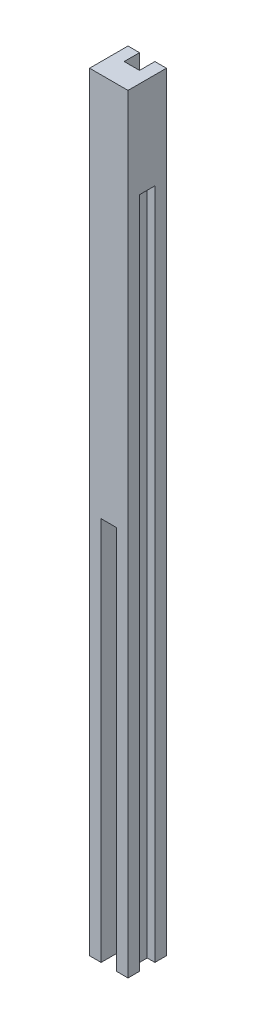
ISO-10303-21;
HEADER;
FILE_DESCRIPTION(('STEP AP214'),'2;1');
FILE_NAME('part.step','',(''),(''),'','','');
FILE_SCHEMA(('AUTOMOTIVE_DESIGN { 1 0 10303 214 1 1 1 1 }'));
ENDSEC;
DATA;
#1=APPLICATION_CONTEXT('core data for automotive mechanical design processes');
#2=APPLICATION_PROTOCOL_DEFINITION('international standard','automotive_design',2000,#1);
#3=PRODUCT_CONTEXT('',#1,'mechanical');
#4=PRODUCT('Part','Part','',(#3));
#5=PRODUCT_RELATED_PRODUCT_CATEGORY('part','',(#4));
#6=PRODUCT_DEFINITION_FORMATION('','',#4);
#7=PRODUCT_DEFINITION_CONTEXT('part definition',#1,'design');
#8=PRODUCT_DEFINITION('design','',#6,#7);
#9=PRODUCT_DEFINITION_SHAPE('','',#8);
#10=(LENGTH_UNIT() NAMED_UNIT(*) SI_UNIT(.MILLI.,.METRE.));
#11=(NAMED_UNIT(*) PLANE_ANGLE_UNIT() SI_UNIT($,.RADIAN.));
#12=(NAMED_UNIT(*) SI_UNIT($,.STERADIAN.) SOLID_ANGLE_UNIT());
#13=UNCERTAINTY_MEASURE_WITH_UNIT(LENGTH_MEASURE(1.E-05),#10,'distance_accuracy_value','');
#14=(GEOMETRIC_REPRESENTATION_CONTEXT(3) GLOBAL_UNCERTAINTY_ASSIGNED_CONTEXT((#13)) GLOBAL_UNIT_ASSIGNED_CONTEXT((#10,
#11,#12)) REPRESENTATION_CONTEXT('',''));
#15=CARTESIAN_POINT('',(0.,0.,0.));
#16=DIRECTION('',(0.,0.,1.));
#17=DIRECTION('',(1.,0.,0.));
#18=AXIS2_PLACEMENT_3D('',#15,#16,#17);
#19=CARTESIAN_POINT('',(-33.4918902303552,200.,-32.6944400252682));
#20=DIRECTION('',(-1.,0.,0.));
#21=DIRECTION('',(0.,0.,1.));
#22=AXIS2_PLACEMENT_3D('',#19,#20,#21);
#23=PLANE('',#22);
#24=DIRECTION('',(0.,-1.,0.));
#25=VECTOR('',#24,1.);
#26=CARTESIAN_POINT('',(-33.4918902303552,175.,-29.6944400252681));
#27=LINE('',#26,#25);
#28=CARTESIAN_POINT('',(-33.4918902303552,175.,-29.6944400252681));
#29=VERTEX_POINT('',#28);
#30=CARTESIAN_POINT('',(-33.4918902303552,0.,-29.6944400252681));
#31=VERTEX_POINT('',#30);
#32=EDGE_CURVE('E193',#29,#31,#27,.T.);
#33=ORIENTED_EDGE('',*,*,#32,.T.);
#34=DIRECTION('',(0.,0.,-1.));
#35=VECTOR('',#34,1.);
#36=CARTESIAN_POINT('',(-33.4918902303552,0.,-32.6944400252682));
#37=LINE('',#36,#35);
#38=CARTESIAN_POINT('',(-33.4918902303552,0.,-32.6944400252682));
#39=VERTEX_POINT('',#38);
#40=EDGE_CURVE('E302',#31,#39,#37,.T.);
#41=ORIENTED_EDGE('',*,*,#40,.T.);
#42=DIRECTION('',(0.,-1.,0.));
#43=VECTOR('',#42,1.);
#44=CARTESIAN_POINT('',(-33.4918902303552,200.,-32.6944400252682));
#45=LINE('',#44,#43);
#46=CARTESIAN_POINT('',(-33.4918902303552,200.,-32.6944400252682));
#47=VERTEX_POINT('',#46);
#48=EDGE_CURVE('E309',#47,#39,#45,.T.);
#49=ORIENTED_EDGE('',*,*,#48,.F.);
#50=DIRECTION('',(0.,0.,-1.));
#51=VECTOR('',#50,1.);
#52=CARTESIAN_POINT('',(-33.4918902303552,200.,-32.6944400252682));
#53=LINE('',#52,#51);
#54=CARTESIAN_POINT('',(-33.4918902303552,200.,-22.6944400252682));
#55=VERTEX_POINT('',#54);
#56=EDGE_CURVE('E288',#55,#47,#53,.T.);
#57=ORIENTED_EDGE('',*,*,#56,.F.);
#58=DIRECTION('',(0.,-1.,0.));
#59=VECTOR('',#58,1.);
#60=CARTESIAN_POINT('',(-33.4918902303552,200.,-22.6944400252682));
#61=LINE('',#60,#59);
#62=CARTESIAN_POINT('',(-33.4918902303552,0.,-22.6944400252682));
#63=VERTEX_POINT('',#62);
#64=EDGE_CURVE('E42',#55,#63,#61,.T.);
#65=ORIENTED_EDGE('',*,*,#64,.T.);
#66=CARTESIAN_POINT('',(-33.4918902303552,0.,-25.6944400252682));
#67=VERTEX_POINT('',#66);
#68=EDGE_CURVE('E303',#63,#67,#37,.T.);
#69=ORIENTED_EDGE('',*,*,#68,.T.);
#70=DIRECTION('',(0.,-1.,0.));
#71=VECTOR('',#70,1.);
#72=CARTESIAN_POINT('',(-33.4918902303552,175.,-25.6944400252681));
#73=LINE('',#72,#71);
#74=CARTESIAN_POINT('',(-33.4918902303552,175.,-25.6944400252681));
#75=VERTEX_POINT('',#74);
#76=EDGE_CURVE('E189',#75,#67,#73,.T.);
#77=ORIENTED_EDGE('',*,*,#76,.F.);
#78=DIRECTION('',(0.,0.,-1.));
#79=VECTOR('',#78,1.);
#80=CARTESIAN_POINT('',(-33.4918902303552,175.,-25.6944400252681));
#81=LINE('',#80,#79);
#82=EDGE_CURVE('E329',#75,#29,#81,.T.);
#83=ORIENTED_EDGE('',*,*,#82,.T.);
#84=EDGE_LOOP('',(#33,#41,#49,#57,#65,#69,#77,#83));
#85=FACE_BOUND('',#84,.T.);
#86=ADVANCED_FACE('F34',(#85),#23,.F.);
#87=CARTESIAN_POINT('',(0.,0.,0.));
#88=DIRECTION('',(0.,1.,0.));
#89=DIRECTION('',(0.,0.,1.));
#90=AXIS2_PLACEMENT_3D('',#87,#88,#89);
#91=PLANE('',#90);
#92=DIRECTION('',(1.,0.,0.));
#93=VECTOR('',#92,1.);
#94=CARTESIAN_POINT('',(-35.4918902303552,0.,-29.6944400252681));
#95=LINE('',#94,#93);
#96=CARTESIAN_POINT('',(-35.4918902303552,0.,-29.6944400252681));
#97=VERTEX_POINT('',#96);
#98=EDGE_CURVE('E195',#97,#31,#95,.T.);
#99=ORIENTED_EDGE('',*,*,#98,.F.);
#100=DIRECTION('',(0.,0.,-1.));
#101=VECTOR('',#100,1.);
#102=CARTESIAN_POINT('',(-35.4918902303552,0.,-25.6944400252682));
#103=LINE('',#102,#101);
#104=CARTESIAN_POINT('',(-35.4918902303552,0.,-25.6944400252681));
#105=VERTEX_POINT('',#104);
#106=EDGE_CURVE('E177',#105,#97,#103,.T.);
#107=ORIENTED_EDGE('',*,*,#106,.F.);
#108=DIRECTION('',(1.,0.,0.));
#109=VECTOR('',#108,1.);
#110=CARTESIAN_POINT('',(-35.4918902303552,0.,-25.6944400252682));
#111=LINE('',#110,#109);
#112=EDGE_CURVE('E199',#105,#67,#111,.T.);
#113=ORIENTED_EDGE('',*,*,#112,.T.);
#114=ORIENTED_EDGE('',*,*,#68,.F.);
#115=DIRECTION('',(1.,0.,0.));
#116=VECTOR('',#115,1.);
#117=CARTESIAN_POINT('',(-43.4918902303552,0.,-22.6944400252682));
#118=LINE('',#117,#116);
#119=CARTESIAN_POINT('',(-36.4918902303553,0.,-22.6944400252682));
#120=VERTEX_POINT('',#119);
#121=EDGE_CURVE('E298',#120,#63,#118,.T.);
#122=ORIENTED_EDGE('',*,*,#121,.F.);
#123=DIRECTION('',(0.,0.,1.));
#124=VECTOR('',#123,1.);
#125=CARTESIAN_POINT('',(-36.4918902303553,0.,-26.6944400252682));
#126=LINE('',#125,#124);
#127=CARTESIAN_POINT('',(-36.4918902303553,0.,-26.6944400252682));
#128=VERTEX_POINT('',#127);
#129=EDGE_CURVE('E221',#128,#120,#126,.T.);
#130=ORIENTED_EDGE('',*,*,#129,.F.);
#131=DIRECTION('',(1.,0.,0.));
#132=VECTOR('',#131,1.);
#133=CARTESIAN_POINT('',(-40.4918902303553,0.,-26.6944400252682));
#134=LINE('',#133,#132);
#135=CARTESIAN_POINT('',(-40.4918902303553,0.,-26.6944400252682));
#136=VERTEX_POINT('',#135);
#137=EDGE_CURVE('E204',#136,#128,#134,.T.);
#138=ORIENTED_EDGE('',*,*,#137,.F.);
#139=DIRECTION('',(0.,0.,1.));
#140=VECTOR('',#139,1.);
#141=CARTESIAN_POINT('',(-40.4918902303553,0.,-26.6944400252682));
#142=LINE('',#141,#140);
#143=CARTESIAN_POINT('',(-40.4918902303553,0.,-22.6944400252682));
#144=VERTEX_POINT('',#143);
#145=EDGE_CURVE('E210',#136,#144,#142,.T.);
#146=ORIENTED_EDGE('',*,*,#145,.T.);
#147=CARTESIAN_POINT('',(-43.4918902303552,0.,-22.6944400252682));
#148=VERTEX_POINT('',#147);
#149=EDGE_CURVE('E299',#148,#144,#118,.T.);
#150=ORIENTED_EDGE('',*,*,#149,.F.);
#151=DIRECTION('',(0.,0.,1.));
#152=VECTOR('',#151,1.);
#153=CARTESIAN_POINT('',(-43.4918902303552,0.,-32.6944400252682));
#154=LINE('',#153,#152);
#155=CARTESIAN_POINT('',(-43.4918902303552,0.,-25.6944400252682));
#156=VERTEX_POINT('',#155);
#157=EDGE_CURVE('E275',#156,#148,#154,.T.);
#158=ORIENTED_EDGE('',*,*,#157,.F.);
#159=DIRECTION('',(-1.,0.,0.));
#160=VECTOR('',#159,1.);
#161=CARTESIAN_POINT('',(-41.4918902303552,0.,-25.6944400252682));
#162=LINE('',#161,#160);
#163=CARTESIAN_POINT('',(-41.4918902303552,0.,-25.6944400252682));
#164=VERTEX_POINT('',#163);
#165=EDGE_CURVE('E249',#164,#156,#162,.T.);
#166=ORIENTED_EDGE('',*,*,#165,.F.);
#167=DIRECTION('',(0.,0.,1.));
#168=VECTOR('',#167,1.);
#169=CARTESIAN_POINT('',(-41.4918902303552,0.,-29.6944400252682));
#170=LINE('',#169,#168);
#171=CARTESIAN_POINT('',(-41.4918902303552,0.,-29.6944400252682));
#172=VERTEX_POINT('',#171);
#173=EDGE_CURVE('E227',#172,#164,#170,.T.);
#174=ORIENTED_EDGE('',*,*,#173,.F.);
#175=DIRECTION('',(-1.,0.,0.));
#176=VECTOR('',#175,1.);
#177=CARTESIAN_POINT('',(-41.4918902303552,0.,-29.6944400252682));
#178=LINE('',#177,#176);
#179=CARTESIAN_POINT('',(-43.4918902303552,0.,-29.6944400252682));
#180=VERTEX_POINT('',#179);
#181=EDGE_CURVE('E237',#172,#180,#178,.T.);
#182=ORIENTED_EDGE('',*,*,#181,.T.);
#183=CARTESIAN_POINT('',(-43.4918902303552,0.,-32.6944400252682));
#184=VERTEX_POINT('',#183);
#185=EDGE_CURVE('E295',#184,#180,#154,.T.);
#186=ORIENTED_EDGE('',*,*,#185,.F.);
#187=DIRECTION('',(-1.,0.,0.));
#188=VECTOR('',#187,1.);
#189=CARTESIAN_POINT('',(-43.4918902303552,0.,-32.6944400252682));
#190=LINE('',#189,#188);
#191=EDGE_CURVE('E286',#39,#184,#190,.T.);
#192=ORIENTED_EDGE('',*,*,#191,.F.);
#193=ORIENTED_EDGE('',*,*,#40,.F.);
#194=EDGE_LOOP('',(#99,#107,#113,#114,#122,#130,#138,#146,#150,#158,#166,#174,#182,#186,#192,#193));
#195=FACE_BOUND('',#194,.T.);
#196=ADVANCED_FACE('F322',(#195),#91,.F.);
#197=CARTESIAN_POINT('',(-43.4918902303552,200.,-32.6944400252682));
#198=DIRECTION('',(1.,0.,0.));
#199=DIRECTION('',(0.,0.,-1.));
#200=AXIS2_PLACEMENT_3D('',#197,#198,#199);
#201=PLANE('',#200);
#202=ORIENTED_EDGE('',*,*,#185,.T.);
#203=DIRECTION('',(0.,-1.,0.));
#204=VECTOR('',#203,1.);
#205=CARTESIAN_POINT('',(-43.4918902303552,175.,-29.6944400252682));
#206=LINE('',#205,#204);
#207=CARTESIAN_POINT('',(-43.4918902303552,175.,-29.6944400252682));
#208=VERTEX_POINT('',#207);
#209=EDGE_CURVE('E218',#208,#180,#206,.T.);
#210=ORIENTED_EDGE('',*,*,#209,.F.);
#211=DIRECTION('',(0.,0.,-1.));
#212=VECTOR('',#211,1.);
#213=CARTESIAN_POINT('',(-43.4918902303552,175.,-29.6944400252682));
#214=LINE('',#213,#212);
#215=CARTESIAN_POINT('',(-43.4918902303552,175.,-25.6944400252682));
#216=VERTEX_POINT('',#215);
#217=EDGE_CURVE('E228',#216,#208,#214,.T.);
#218=ORIENTED_EDGE('',*,*,#217,.F.);
#219=DIRECTION('',(0.,1.,0.));
#220=VECTOR('',#219,1.);
#221=CARTESIAN_POINT('',(-43.4918902303552,175.,-25.6944400252682));
#222=LINE('',#221,#220);
#223=EDGE_CURVE('E239',#156,#216,#222,.T.);
#224=ORIENTED_EDGE('',*,*,#223,.F.);
#225=ORIENTED_EDGE('',*,*,#157,.T.);
#226=DIRECTION('',(0.,-1.,0.));
#227=VECTOR('',#226,1.);
#228=CARTESIAN_POINT('',(-43.4918902303552,200.,-22.6944400252682));
#229=LINE('',#228,#227);
#230=CARTESIAN_POINT('',(-43.4918902303552,200.,-22.6944400252682));
#231=VERTEX_POINT('',#230);
#232=EDGE_CURVE('E11',#231,#148,#229,.T.);
#233=ORIENTED_EDGE('',*,*,#232,.F.);
#234=DIRECTION('',(0.,0.,1.));
#235=VECTOR('',#234,1.);
#236=CARTESIAN_POINT('',(-43.4918902303552,200.,-32.6944400252682));
#237=LINE('',#236,#235);
#238=CARTESIAN_POINT('',(-43.4918902303552,200.,-32.6944400252682));
#239=VERTEX_POINT('',#238);
#240=EDGE_CURVE('E282',#239,#231,#237,.T.);
#241=ORIENTED_EDGE('',*,*,#240,.F.);
#242=DIRECTION('',(0.,-1.,0.));
#243=VECTOR('',#242,1.);
#244=CARTESIAN_POINT('',(-43.4918902303552,200.,-32.6944400252682));
#245=LINE('',#244,#243);
#246=EDGE_CURVE('E294',#239,#184,#245,.T.);
#247=ORIENTED_EDGE('',*,*,#246,.T.);
#248=EDGE_LOOP('',(#202,#210,#218,#224,#225,#233,#241,#247));
#249=FACE_BOUND('',#248,.T.);
#250=ADVANCED_FACE('F36',(#249),#201,.F.);
#251=CARTESIAN_POINT('',(-43.4918902303552,200.,-22.6944400252682));
#252=DIRECTION('',(0.,0.,-1.));
#253=DIRECTION('',(-1.,0.,0.));
#254=AXIS2_PLACEMENT_3D('',#251,#252,#253);
#255=PLANE('',#254);
#256=ORIENTED_EDGE('',*,*,#149,.T.);
#257=DIRECTION('',(0.,-1.,0.));
#258=VECTOR('',#257,1.);
#259=CARTESIAN_POINT('',(-40.4918902303553,100.,-22.6944400252682));
#260=LINE('',#259,#258);
#261=CARTESIAN_POINT('',(-40.4918902303553,100.,-22.6944400252682));
#262=VERTEX_POINT('',#261);
#263=EDGE_CURVE('E194',#262,#144,#260,.T.);
#264=ORIENTED_EDGE('',*,*,#263,.F.);
#265=DIRECTION('',(1.,0.,0.));
#266=VECTOR('',#265,1.);
#267=CARTESIAN_POINT('',(-40.4918902303553,100.,-22.6944400252682));
#268=LINE('',#267,#266);
#269=CARTESIAN_POINT('',(-36.4918902303553,100.,-22.6944400252682));
#270=VERTEX_POINT('',#269);
#271=EDGE_CURVE('E205',#262,#270,#268,.T.);
#272=ORIENTED_EDGE('',*,*,#271,.T.);
#273=DIRECTION('',(0.,-1.,0.));
#274=VECTOR('',#273,1.);
#275=CARTESIAN_POINT('',(-36.4918902303553,100.,-22.6944400252682));
#276=LINE('',#275,#274);
#277=EDGE_CURVE('E197',#270,#120,#276,.T.);
#278=ORIENTED_EDGE('',*,*,#277,.T.);
#279=ORIENTED_EDGE('',*,*,#121,.T.);
#280=ORIENTED_EDGE('',*,*,#64,.F.);
#281=DIRECTION('',(1.,0.,0.));
#282=VECTOR('',#281,1.);
#283=CARTESIAN_POINT('',(-43.4918902303552,200.,-22.6944400252682));
#284=LINE('',#283,#282);
#285=EDGE_CURVE('E285',#231,#55,#284,.T.);
#286=ORIENTED_EDGE('',*,*,#285,.F.);
#287=ORIENTED_EDGE('',*,*,#232,.T.);
#288=EDGE_LOOP('',(#256,#264,#272,#278,#279,#280,#286,#287));
#289=FACE_BOUND('',#288,.T.);
#290=ADVANCED_FACE('F350',(#289),#255,.F.);
#291=CARTESIAN_POINT('',(-43.4918902303552,200.,-32.6944400252682));
#292=DIRECTION('',(0.,0.,1.));
#293=DIRECTION('',(1.,0.,0.));
#294=AXIS2_PLACEMENT_3D('',#291,#292,#293);
#295=PLANE('',#294);
#296=DIRECTION('',(-1.,0.,0.));
#297=VECTOR('',#296,1.);
#298=CARTESIAN_POINT('',(-36.4918902303552,100.,-32.6944400252682));
#299=LINE('',#298,#297);
#300=CARTESIAN_POINT('',(-36.4918902303552,100.,-32.6944400252682));
#301=VERTEX_POINT('',#300);
#302=CARTESIAN_POINT('',(-40.4918902303552,100.,-32.6944400252682));
#303=VERTEX_POINT('',#302);
#304=EDGE_CURVE('E268',#301,#303,#299,.T.);
#305=ORIENTED_EDGE('',*,*,#304,.F.);
#306=DIRECTION('',(0.,-1.,0.));
#307=VECTOR('',#306,1.);
#308=CARTESIAN_POINT('',(-36.4918902303552,200.,-32.6944400252682));
#309=LINE('',#308,#307);
#310=CARTESIAN_POINT('',(-36.4918902303552,200.,-32.6944400252682));
#311=VERTEX_POINT('',#310);
#312=EDGE_CURVE('E246',#311,#301,#309,.T.);
#313=ORIENTED_EDGE('',*,*,#312,.F.);
#314=DIRECTION('',(-1.,0.,0.));
#315=VECTOR('',#314,1.);
#316=CARTESIAN_POINT('',(-43.4918902303552,200.,-32.6944400252682));
#317=LINE('',#316,#315);
#318=EDGE_CURVE('E291',#47,#311,#317,.T.);
#319=ORIENTED_EDGE('',*,*,#318,.F.);
#320=ORIENTED_EDGE('',*,*,#48,.T.);
#321=ORIENTED_EDGE('',*,*,#191,.T.);
#322=ORIENTED_EDGE('',*,*,#246,.F.);
#323=CARTESIAN_POINT('',(-40.4918902303552,200.,-32.6944400252682));
#324=VERTEX_POINT('',#323);
#325=EDGE_CURVE('E290',#324,#239,#317,.T.);
#326=ORIENTED_EDGE('',*,*,#325,.F.);
#327=DIRECTION('',(0.,-1.,0.));
#328=VECTOR('',#327,1.);
#329=CARTESIAN_POINT('',(-40.4918902303552,200.,-32.6944400252682));
#330=LINE('',#329,#328);
#331=EDGE_CURVE('E257',#324,#303,#330,.T.);
#332=ORIENTED_EDGE('',*,*,#331,.T.);
#333=EDGE_LOOP('',(#305,#313,#319,#320,#321,#322,#326,#332));
#334=FACE_BOUND('',#333,.T.);
#335=ADVANCED_FACE('F349',(#334),#295,.F.);
#336=CARTESIAN_POINT('',(0.,200.,0.));
#337=DIRECTION('',(0.,1.,0.));
#338=DIRECTION('',(0.,0.,1.));
#339=AXIS2_PLACEMENT_3D('',#336,#337,#338);
#340=PLANE('',#339);
#341=DIRECTION('',(0.,0.,-1.));
#342=VECTOR('',#341,1.);
#343=CARTESIAN_POINT('',(-36.4918902303552,200.,-28.6944400252682));
#344=LINE('',#343,#342);
#345=CARTESIAN_POINT('',(-36.4918902303552,200.,-28.6944400252682));
#346=VERTEX_POINT('',#345);
#347=EDGE_CURVE('E273',#346,#311,#344,.T.);
#348=ORIENTED_EDGE('',*,*,#347,.F.);
#349=DIRECTION('',(-1.,0.,0.));
#350=VECTOR('',#349,1.);
#351=CARTESIAN_POINT('',(-36.4918902303552,200.,-28.6944400252682));
#352=LINE('',#351,#350);
#353=CARTESIAN_POINT('',(-40.4918902303552,200.,-28.6944400252682));
#354=VERTEX_POINT('',#353);
#355=EDGE_CURVE('E262',#346,#354,#352,.T.);
#356=ORIENTED_EDGE('',*,*,#355,.T.);
#357=DIRECTION('',(0.,0.,-1.));
#358=VECTOR('',#357,1.);
#359=CARTESIAN_POINT('',(-40.4918902303552,200.,-28.6944400252682));
#360=LINE('',#359,#358);
#361=EDGE_CURVE('E276',#354,#324,#360,.T.);
#362=ORIENTED_EDGE('',*,*,#361,.T.);
#363=ORIENTED_EDGE('',*,*,#325,.T.);
#364=ORIENTED_EDGE('',*,*,#240,.T.);
#365=ORIENTED_EDGE('',*,*,#285,.T.);
#366=ORIENTED_EDGE('',*,*,#56,.T.);
#367=ORIENTED_EDGE('',*,*,#318,.T.);
#368=EDGE_LOOP('',(#348,#356,#362,#363,#364,#365,#366,#367));
#369=FACE_BOUND('',#368,.T.);
#370=ADVANCED_FACE('F356',(#369),#340,.T.);
#371=CARTESIAN_POINT('',(-36.4918902303552,200.,-28.6944400252682));
#372=DIRECTION('',(1.,0.,0.));
#373=DIRECTION('',(0.,1.,0.));
#374=AXIS2_PLACEMENT_3D('',#371,#372,#373);
#375=PLANE('',#374);
#376=ORIENTED_EDGE('',*,*,#312,.T.);
#377=DIRECTION('',(0.,0.,-1.));
#378=VECTOR('',#377,1.);
#379=CARTESIAN_POINT('',(-36.4918902303552,100.,-28.6944400252682));
#380=LINE('',#379,#378);
#381=CARTESIAN_POINT('',(-36.4918902303552,100.,-28.6944400252682));
#382=VERTEX_POINT('',#381);
#383=EDGE_CURVE('E265',#382,#301,#380,.T.);
#384=ORIENTED_EDGE('',*,*,#383,.F.);
#385=DIRECTION('',(0.,-1.,0.));
#386=VECTOR('',#385,1.);
#387=CARTESIAN_POINT('',(-36.4918902303552,200.,-28.6944400252682));
#388=LINE('',#387,#386);
#389=EDGE_CURVE('E253',#346,#382,#388,.T.);
#390=ORIENTED_EDGE('',*,*,#389,.F.);
#391=ORIENTED_EDGE('',*,*,#347,.T.);
#392=EDGE_LOOP('',(#376,#384,#390,#391));
#393=FACE_BOUND('',#392,.T.);
#394=ADVANCED_FACE('F413',(#393),#375,.F.);
#395=CARTESIAN_POINT('',(-40.4918902303552,200.,-28.6944400252682));
#396=DIRECTION('',(1.,0.,0.));
#397=DIRECTION('',(0.,1.,0.));
#398=AXIS2_PLACEMENT_3D('',#395,#396,#397);
#399=PLANE('',#398);
#400=ORIENTED_EDGE('',*,*,#331,.F.);
#401=ORIENTED_EDGE('',*,*,#361,.F.);
#402=DIRECTION('',(0.,-1.,0.));
#403=VECTOR('',#402,1.);
#404=CARTESIAN_POINT('',(-40.4918902303552,200.,-28.6944400252682));
#405=LINE('',#404,#403);
#406=CARTESIAN_POINT('',(-40.4918902303552,100.,-28.6944400252682));
#407=VERTEX_POINT('',#406);
#408=EDGE_CURVE('E260',#354,#407,#405,.T.);
#409=ORIENTED_EDGE('',*,*,#408,.T.);
#410=DIRECTION('',(0.,0.,-1.));
#411=VECTOR('',#410,1.);
#412=CARTESIAN_POINT('',(-40.4918902303552,100.,-28.6944400252682));
#413=LINE('',#412,#411);
#414=EDGE_CURVE('E279',#407,#303,#413,.T.);
#415=ORIENTED_EDGE('',*,*,#414,.T.);
#416=EDGE_LOOP('',(#400,#401,#409,#415));
#417=FACE_BOUND('',#416,.T.);
#418=ADVANCED_FACE('F410',(#417),#399,.T.);
#419=CARTESIAN_POINT('',(-36.4918902303552,100.,-28.6944400252682));
#420=DIRECTION('',(0.,-1.,0.));
#421=DIRECTION('',(0.,0.,-1.));
#422=AXIS2_PLACEMENT_3D('',#419,#420,#421);
#423=PLANE('',#422);
#424=ORIENTED_EDGE('',*,*,#304,.T.);
#425=ORIENTED_EDGE('',*,*,#414,.F.);
#426=DIRECTION('',(-1.,0.,0.));
#427=VECTOR('',#426,1.);
#428=CARTESIAN_POINT('',(-36.4918902303552,100.,-28.6944400252682));
#429=LINE('',#428,#427);
#430=EDGE_CURVE('E256',#382,#407,#429,.T.);
#431=ORIENTED_EDGE('',*,*,#430,.F.);
#432=ORIENTED_EDGE('',*,*,#383,.T.);
#433=EDGE_LOOP('',(#424,#425,#431,#432));
#434=FACE_BOUND('',#433,.T.);
#435=ADVANCED_FACE('F408',(#434),#423,.F.);
#436=CARTESIAN_POINT('',(0.,0.,-28.6944400252682));
#437=DIRECTION('',(0.,0.,-1.));
#438=DIRECTION('',(-1.,0.,0.));
#439=AXIS2_PLACEMENT_3D('',#436,#437,#438);
#440=PLANE('',#439);
#441=ORIENTED_EDGE('',*,*,#389,.T.);
#442=ORIENTED_EDGE('',*,*,#430,.T.);
#443=ORIENTED_EDGE('',*,*,#408,.F.);
#444=ORIENTED_EDGE('',*,*,#355,.F.);
#445=EDGE_LOOP('',(#441,#442,#443,#444));
#446=FACE_BOUND('',#445,.T.);
#447=ADVANCED_FACE('F404',(#446),#440,.T.);
#448=CARTESIAN_POINT('',(-41.4918902303552,175.,-29.6944400252682));
#449=DIRECTION('',(0.,0.,-1.));
#450=DIRECTION('',(-1.,0.,0.));
#451=AXIS2_PLACEMENT_3D('',#448,#449,#450);
#452=PLANE('',#451);
#453=ORIENTED_EDGE('',*,*,#209,.T.);
#454=ORIENTED_EDGE('',*,*,#181,.F.);
#455=DIRECTION('',(0.,-1.,0.));
#456=VECTOR('',#455,1.);
#457=CARTESIAN_POINT('',(-41.4918902303552,175.,-29.6944400252682));
#458=LINE('',#457,#456);
#459=CARTESIAN_POINT('',(-41.4918902303552,175.,-29.6944400252682));
#460=VERTEX_POINT('',#459);
#461=EDGE_CURVE('E225',#460,#172,#458,.T.);
#462=ORIENTED_EDGE('',*,*,#461,.F.);
#463=DIRECTION('',(-1.,0.,0.));
#464=VECTOR('',#463,1.);
#465=CARTESIAN_POINT('',(-41.4918902303552,175.,-29.6944400252682));
#466=LINE('',#465,#464);
#467=EDGE_CURVE('E244',#460,#208,#466,.T.);
#468=ORIENTED_EDGE('',*,*,#467,.T.);
#469=EDGE_LOOP('',(#453,#454,#462,#468));
#470=FACE_BOUND('',#469,.T.);
#471=ADVANCED_FACE('F397',(#470),#452,.F.);
#472=CARTESIAN_POINT('',(-41.4918902303552,175.,-29.6944400252682));
#473=DIRECTION('',(0.,1.,0.));
#474=DIRECTION('',(0.,0.,1.));
#475=AXIS2_PLACEMENT_3D('',#472,#473,#474);
#476=PLANE('',#475);
#477=ORIENTED_EDGE('',*,*,#217,.T.);
#478=ORIENTED_EDGE('',*,*,#467,.F.);
#479=DIRECTION('',(0.,0.,-1.));
#480=VECTOR('',#479,1.);
#481=CARTESIAN_POINT('',(-41.4918902303552,175.,-29.6944400252682));
#482=LINE('',#481,#480);
#483=CARTESIAN_POINT('',(-41.4918902303552,175.,-25.6944400252682));
#484=VERTEX_POINT('',#483);
#485=EDGE_CURVE('E234',#484,#460,#482,.T.);
#486=ORIENTED_EDGE('',*,*,#485,.F.);
#487=DIRECTION('',(-1.,0.,0.));
#488=VECTOR('',#487,1.);
#489=CARTESIAN_POINT('',(-41.4918902303552,175.,-25.6944400252682));
#490=LINE('',#489,#488);
#491=EDGE_CURVE('E247',#484,#216,#490,.T.);
#492=ORIENTED_EDGE('',*,*,#491,.T.);
#493=EDGE_LOOP('',(#477,#478,#486,#492));
#494=FACE_BOUND('',#493,.T.);
#495=ADVANCED_FACE('F394',(#494),#476,.F.);
#496=CARTESIAN_POINT('',(-41.4918902303552,175.,-25.6944400252682));
#497=DIRECTION('',(0.,0.,1.));
#498=DIRECTION('',(1.,0.,0.));
#499=AXIS2_PLACEMENT_3D('',#496,#497,#498);
#500=PLANE('',#499);
#501=ORIENTED_EDGE('',*,*,#223,.T.);
#502=ORIENTED_EDGE('',*,*,#491,.F.);
#503=DIRECTION('',(0.,1.,0.));
#504=VECTOR('',#503,1.);
#505=CARTESIAN_POINT('',(-41.4918902303552,175.,-25.6944400252682));
#506=LINE('',#505,#504);
#507=EDGE_CURVE('E231',#164,#484,#506,.T.);
#508=ORIENTED_EDGE('',*,*,#507,.F.);
#509=ORIENTED_EDGE('',*,*,#165,.T.);
#510=EDGE_LOOP('',(#501,#502,#508,#509));
#511=FACE_BOUND('',#510,.T.);
#512=ADVANCED_FACE('F392',(#511),#500,.F.);
#513=CARTESIAN_POINT('',(-41.4918902303552,0.,0.));
#514=DIRECTION('',(-1.,0.,0.));
#515=DIRECTION('',(0.,0.,1.));
#516=AXIS2_PLACEMENT_3D('',#513,#514,#515);
#517=PLANE('',#516);
#518=ORIENTED_EDGE('',*,*,#461,.T.);
#519=ORIENTED_EDGE('',*,*,#173,.T.);
#520=ORIENTED_EDGE('',*,*,#507,.T.);
#521=ORIENTED_EDGE('',*,*,#485,.T.);
#522=EDGE_LOOP('',(#518,#519,#520,#521));
#523=FACE_BOUND('',#522,.T.);
#524=ADVANCED_FACE('F389',(#523),#517,.T.);
#525=CARTESIAN_POINT('',(-40.4918902303553,100.,-26.6944400252682));
#526=DIRECTION('',(-1.,0.,0.));
#527=DIRECTION('',(0.,-1.,0.));
#528=AXIS2_PLACEMENT_3D('',#525,#526,#527);
#529=PLANE('',#528);
#530=ORIENTED_EDGE('',*,*,#263,.T.);
#531=ORIENTED_EDGE('',*,*,#145,.F.);
#532=DIRECTION('',(0.,-1.,0.));
#533=VECTOR('',#532,1.);
#534=CARTESIAN_POINT('',(-40.4918902303553,100.,-26.6944400252682));
#535=LINE('',#534,#533);
#536=CARTESIAN_POINT('',(-40.4918902303553,100.,-26.6944400252682));
#537=VERTEX_POINT('',#536);
#538=EDGE_CURVE('E57',#537,#136,#535,.T.);
#539=ORIENTED_EDGE('',*,*,#538,.F.);
#540=DIRECTION('',(0.,0.,1.));
#541=VECTOR('',#540,1.);
#542=CARTESIAN_POINT('',(-40.4918902303553,100.,-26.6944400252682));
#543=LINE('',#542,#541);
#544=EDGE_CURVE('E216',#537,#262,#543,.T.);
#545=ORIENTED_EDGE('',*,*,#544,.T.);
#546=EDGE_LOOP('',(#530,#531,#539,#545));
#547=FACE_BOUND('',#546,.T.);
#548=ADVANCED_FACE('F366',(#547),#529,.F.);
#549=CARTESIAN_POINT('',(-40.4918902303553,100.,-26.6944400252682));
#550=DIRECTION('',(0.,-1.,0.));
#551=DIRECTION('',(0.,0.,-1.));
#552=AXIS2_PLACEMENT_3D('',#549,#550,#551);
#553=PLANE('',#552);
#554=ORIENTED_EDGE('',*,*,#271,.F.);
#555=ORIENTED_EDGE('',*,*,#544,.F.);
#556=DIRECTION('',(1.,0.,0.));
#557=VECTOR('',#556,1.);
#558=CARTESIAN_POINT('',(-40.4918902303553,100.,-26.6944400252682));
#559=LINE('',#558,#557);
#560=CARTESIAN_POINT('',(-36.4918902303553,100.,-26.6944400252682));
#561=VERTEX_POINT('',#560);
#562=EDGE_CURVE('E209',#537,#561,#559,.T.);
#563=ORIENTED_EDGE('',*,*,#562,.T.);
#564=DIRECTION('',(0.,0.,1.));
#565=VECTOR('',#564,1.);
#566=CARTESIAN_POINT('',(-36.4918902303553,100.,-26.6944400252682));
#567=LINE('',#566,#565);
#568=EDGE_CURVE('E219',#561,#270,#567,.T.);
#569=ORIENTED_EDGE('',*,*,#568,.T.);
#570=EDGE_LOOP('',(#554,#555,#563,#569));
#571=FACE_BOUND('',#570,.T.);
#572=ADVANCED_FACE('F369',(#571),#553,.T.);
#573=CARTESIAN_POINT('',(-36.4918902303553,100.,-26.6944400252682));
#574=DIRECTION('',(-1.,0.,0.));
#575=DIRECTION('',(0.,-1.,0.));
#576=AXIS2_PLACEMENT_3D('',#573,#574,#575);
#577=PLANE('',#576);
#578=ORIENTED_EDGE('',*,*,#277,.F.);
#579=ORIENTED_EDGE('',*,*,#568,.F.);
#580=DIRECTION('',(0.,-1.,0.));
#581=VECTOR('',#580,1.);
#582=CARTESIAN_POINT('',(-36.4918902303553,100.,-26.6944400252682));
#583=LINE('',#582,#581);
#584=EDGE_CURVE('E207',#561,#128,#583,.T.);
#585=ORIENTED_EDGE('',*,*,#584,.T.);
#586=ORIENTED_EDGE('',*,*,#129,.T.);
#587=EDGE_LOOP('',(#578,#579,#585,#586));
#588=FACE_BOUND('',#587,.T.);
#589=ADVANCED_FACE('F373',(#588),#577,.T.);
#590=CARTESIAN_POINT('',(0.,0.,-26.6944400252682));
#591=DIRECTION('',(0.,0.,1.));
#592=DIRECTION('',(1.,0.,0.));
#593=AXIS2_PLACEMENT_3D('',#590,#591,#592);
#594=PLANE('',#593);
#595=ORIENTED_EDGE('',*,*,#538,.T.);
#596=ORIENTED_EDGE('',*,*,#137,.T.);
#597=ORIENTED_EDGE('',*,*,#584,.F.);
#598=ORIENTED_EDGE('',*,*,#562,.F.);
#599=EDGE_LOOP('',(#595,#596,#597,#598));
#600=FACE_BOUND('',#599,.T.);
#601=ADVANCED_FACE('F375',(#600),#594,.T.);
#602=CARTESIAN_POINT('',(-35.4918902303552,175.,-25.6944400252681));
#603=DIRECTION('',(0.,-1.,0.));
#604=DIRECTION('',(0.,0.,-1.));
#605=AXIS2_PLACEMENT_3D('',#602,#603,#604);
#606=PLANE('',#605);
#607=ORIENTED_EDGE('',*,*,#82,.F.);
#608=DIRECTION('',(1.,0.,0.));
#609=VECTOR('',#608,1.);
#610=CARTESIAN_POINT('',(-35.4918902303552,175.,-25.6944400252681));
#611=LINE('',#610,#609);
#612=CARTESIAN_POINT('',(-35.4918902303552,175.,-25.6944400252681));
#613=VERTEX_POINT('',#612);
#614=EDGE_CURVE('E188',#613,#75,#611,.T.);
#615=ORIENTED_EDGE('',*,*,#614,.F.);
#616=DIRECTION('',(0.,0.,-1.));
#617=VECTOR('',#616,1.);
#618=CARTESIAN_POINT('',(-35.4918902303552,175.,-25.6944400252681));
#619=LINE('',#618,#617);
#620=CARTESIAN_POINT('',(-35.4918902303552,175.,-29.6944400252681));
#621=VERTEX_POINT('',#620);
#622=EDGE_CURVE('E175',#613,#621,#619,.T.);
#623=ORIENTED_EDGE('',*,*,#622,.T.);
#624=DIRECTION('',(1.,0.,0.));
#625=VECTOR('',#624,1.);
#626=CARTESIAN_POINT('',(-35.4918902303552,175.,-29.6944400252681));
#627=LINE('',#626,#625);
#628=EDGE_CURVE('E186',#621,#29,#627,.T.);
#629=ORIENTED_EDGE('',*,*,#628,.T.);
#630=EDGE_LOOP('',(#607,#615,#623,#629));
#631=FACE_BOUND('',#630,.T.);
#632=ADVANCED_FACE('F185',(#631),#606,.T.);
#633=CARTESIAN_POINT('',(-35.4918902303552,175.,-29.6944400252681));
#634=DIRECTION('',(0.,0.,1.));
#635=DIRECTION('',(0.,-1.,0.));
#636=AXIS2_PLACEMENT_3D('',#633,#634,#635);
#637=PLANE('',#636);
#638=ORIENTED_EDGE('',*,*,#32,.F.);
#639=ORIENTED_EDGE('',*,*,#628,.F.);
#640=DIRECTION('',(0.,-1.,0.));
#641=VECTOR('',#640,1.);
#642=CARTESIAN_POINT('',(-35.4918902303552,175.,-29.6944400252681));
#643=LINE('',#642,#641);
#644=EDGE_CURVE('E172',#621,#97,#643,.T.);
#645=ORIENTED_EDGE('',*,*,#644,.T.);
#646=ORIENTED_EDGE('',*,*,#98,.T.);
#647=EDGE_LOOP('',(#638,#639,#645,#646));
#648=FACE_BOUND('',#647,.T.);
#649=ADVANCED_FACE('F191',(#648),#637,.T.);
#650=CARTESIAN_POINT('',(-35.4918902303552,175.,-25.6944400252681));
#651=DIRECTION('',(0.,0.,1.));
#652=DIRECTION('',(0.,-1.,0.));
#653=AXIS2_PLACEMENT_3D('',#650,#651,#652);
#654=PLANE('',#653);
#655=ORIENTED_EDGE('',*,*,#76,.T.);
#656=ORIENTED_EDGE('',*,*,#112,.F.);
#657=DIRECTION('',(0.,-1.,0.));
#658=VECTOR('',#657,1.);
#659=CARTESIAN_POINT('',(-35.4918902303552,175.,-25.6944400252681));
#660=LINE('',#659,#658);
#661=EDGE_CURVE('E49',#613,#105,#660,.T.);
#662=ORIENTED_EDGE('',*,*,#661,.F.);
#663=ORIENTED_EDGE('',*,*,#614,.T.);
#664=EDGE_LOOP('',(#655,#656,#662,#663));
#665=FACE_BOUND('',#664,.T.);
#666=ADVANCED_FACE('F333',(#665),#654,.F.);
#667=CARTESIAN_POINT('',(-35.4918902303552,0.,0.));
#668=DIRECTION('',(-1.,0.,0.));
#669=DIRECTION('',(0.,0.,1.));
#670=AXIS2_PLACEMENT_3D('',#667,#668,#669);
#671=PLANE('',#670);
#672=ORIENTED_EDGE('',*,*,#622,.F.);
#673=ORIENTED_EDGE('',*,*,#661,.T.);
#674=ORIENTED_EDGE('',*,*,#106,.T.);
#675=ORIENTED_EDGE('',*,*,#644,.F.);
#676=EDGE_LOOP('',(#672,#673,#674,#675));
#677=FACE_BOUND('',#676,.T.);
#678=ADVANCED_FACE('F174',(#677),#671,.F.);
#679=CLOSED_SHELL('',(#86,#196,#250,#290,#335,#370,#394,#418,#435,#447,#471,#495,#512,#524,#548,
#572,#589,#601,#632,#649,#666,#678));
#680=MANIFOLD_SOLID_BREP('B2',#679);
#681=ADVANCED_BREP_SHAPE_REPRESENTATION('',(#18,#680),#14);
#682=SHAPE_DEFINITION_REPRESENTATION(#9,#681);
ENDSEC;
END-ISO-10303-21;
